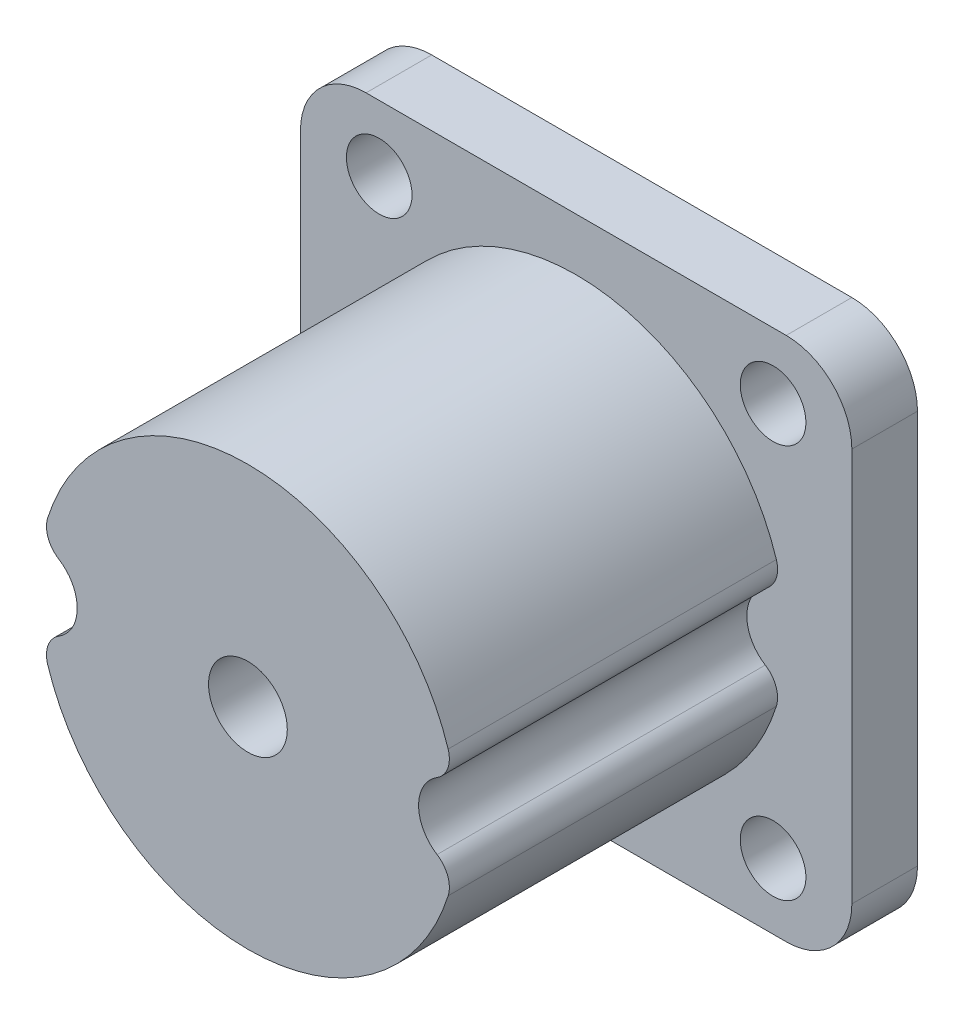
ISO-10303-21;
HEADER;
FILE_DESCRIPTION(('STEP AP214'),'2;1');
FILE_NAME('part.step','',(''),(''),'','','');
FILE_SCHEMA(('AUTOMOTIVE_DESIGN { 1 0 10303 214 1 1 1 1 }'));
ENDSEC;
DATA;
#1=APPLICATION_CONTEXT('core data for automotive mechanical design processes');
#2=APPLICATION_PROTOCOL_DEFINITION('international standard','automotive_design',2000,#1);
#3=PRODUCT_CONTEXT('',#1,'mechanical');
#4=PRODUCT('Part','Part','',(#3));
#5=PRODUCT_RELATED_PRODUCT_CATEGORY('part','',(#4));
#6=PRODUCT_DEFINITION_FORMATION('','',#4);
#7=PRODUCT_DEFINITION_CONTEXT('part definition',#1,'design');
#8=PRODUCT_DEFINITION('design','',#6,#7);
#9=PRODUCT_DEFINITION_SHAPE('','',#8);
#10=(LENGTH_UNIT() NAMED_UNIT(*) SI_UNIT(.MILLI.,.METRE.));
#11=(NAMED_UNIT(*) PLANE_ANGLE_UNIT() SI_UNIT($,.RADIAN.));
#12=(NAMED_UNIT(*) SI_UNIT($,.STERADIAN.) SOLID_ANGLE_UNIT());
#13=UNCERTAINTY_MEASURE_WITH_UNIT(LENGTH_MEASURE(1.E-05),#10,'distance_accuracy_value','');
#14=(GEOMETRIC_REPRESENTATION_CONTEXT(3) GLOBAL_UNCERTAINTY_ASSIGNED_CONTEXT((#13)) GLOBAL_UNIT_ASSIGNED_CONTEXT((#10,
#11,#12)) REPRESENTATION_CONTEXT('',''));
#15=CARTESIAN_POINT('',(0.,0.,0.));
#16=DIRECTION('',(0.,0.,1.));
#17=DIRECTION('',(1.,0.,0.));
#18=AXIS2_PLACEMENT_3D('',#15,#16,#17);
#19=CARTESIAN_POINT('',(0.,0.,5.));
#20=DIRECTION('',(0.,0.,-1.));
#21=DIRECTION('',(-1.,0.,0.));
#22=AXIS2_PLACEMENT_3D('',#19,#20,#21);
#23=PLANE('',#22);
#24=CARTESIAN_POINT('',(16.,0.,5.));
#25=DIRECTION('',(0.,0.,-1.));
#26=DIRECTION('',(1.,0.,0.));
#27=AXIS2_PLACEMENT_3D('',#24,#25,#26);
#28=CIRCLE('',#27,3.);
#29=CARTESIAN_POINT('',(14.40625,-2.54164532094862,5.));
#30=VERTEX_POINT('',#29);
#31=CARTESIAN_POINT('',(14.40625,2.54164532094862,5.));
#32=VERTEX_POINT('',#31);
#33=EDGE_CURVE('E255',#30,#32,#28,.T.);
#34=ORIENTED_EDGE('',*,*,#33,.F.);
#35=CARTESIAN_POINT('',(13.34375,-4.23607553491436,5.));
#36=DIRECTION('',(0.,0.,-1.));
#37=DIRECTION('',(-1.,0.,0.));
#38=AXIS2_PLACEMENT_3D('',#35,#36,#37);
#39=CIRCLE('',#38,2.);
#40=CARTESIAN_POINT('',(15.25,-4.84122918275927,5.));
#41=VERTEX_POINT('',#40);
#42=EDGE_CURVE('E47',#30,#41,#39,.T.);
#43=ORIENTED_EDGE('',*,*,#42,.T.);
#44=CARTESIAN_POINT('',(0.,0.,5.));
#45=DIRECTION('',(0.,0.,1.));
#46=DIRECTION('',(1.,0.,0.));
#47=AXIS2_PLACEMENT_3D('',#44,#45,#46);
#48=CIRCLE('',#47,16.);
#49=CARTESIAN_POINT('',(-15.25,-4.84122918275927,5.));
#50=VERTEX_POINT('',#49);
#51=EDGE_CURVE('E254',#50,#41,#48,.T.);
#52=ORIENTED_EDGE('',*,*,#51,.F.);
#53=CARTESIAN_POINT('',(-13.34375,-4.23607553491436,5.));
#54=DIRECTION('',(0.,0.,-1.));
#55=DIRECTION('',(-1.,0.,0.));
#56=AXIS2_PLACEMENT_3D('',#53,#54,#55);
#57=CIRCLE('',#56,2.);
#58=CARTESIAN_POINT('',(-14.40625,-2.54164532094862,5.));
#59=VERTEX_POINT('',#58);
#60=EDGE_CURVE('E248',#50,#59,#57,.T.);
#61=ORIENTED_EDGE('',*,*,#60,.T.);
#62=CARTESIAN_POINT('',(-16.,0.,5.));
#63=DIRECTION('',(0.,0.,-1.));
#64=DIRECTION('',(1.,0.,0.));
#65=AXIS2_PLACEMENT_3D('',#62,#63,#64);
#66=CIRCLE('',#65,3.);
#67=CARTESIAN_POINT('',(-14.40625,2.54164532094862,5.));
#68=VERTEX_POINT('',#67);
#69=EDGE_CURVE('E262',#68,#59,#66,.T.);
#70=ORIENTED_EDGE('',*,*,#69,.F.);
#71=CARTESIAN_POINT('',(-13.34375,4.23607553491436,5.));
#72=DIRECTION('',(0.,0.,-1.));
#73=DIRECTION('',(-1.,0.,0.));
#74=AXIS2_PLACEMENT_3D('',#71,#72,#73);
#75=CIRCLE('',#74,2.);
#76=CARTESIAN_POINT('',(-15.25,4.84122918275927,5.));
#77=VERTEX_POINT('',#76);
#78=EDGE_CURVE('E250',#68,#77,#75,.T.);
#79=ORIENTED_EDGE('',*,*,#78,.T.);
#80=CARTESIAN_POINT('',(0.,0.,5.));
#81=DIRECTION('',(0.,0.,1.));
#82=DIRECTION('',(1.,0.,0.));
#83=AXIS2_PLACEMENT_3D('',#80,#81,#82);
#84=CIRCLE('',#83,16.);
#85=CARTESIAN_POINT('',(15.25,4.84122918275927,5.));
#86=VERTEX_POINT('',#85);
#87=EDGE_CURVE('E289',#86,#77,#84,.T.);
#88=ORIENTED_EDGE('',*,*,#87,.F.);
#89=CARTESIAN_POINT('',(13.34375,4.23607553491436,5.));
#90=DIRECTION('',(0.,0.,-1.));
#91=DIRECTION('',(-1.,0.,0.));
#92=AXIS2_PLACEMENT_3D('',#89,#90,#91);
#93=CIRCLE('',#92,2.);
#94=EDGE_CURVE('E11',#86,#32,#93,.T.);
#95=ORIENTED_EDGE('',*,*,#94,.T.);
#96=EDGE_LOOP('',(#34,#43,#52,#61,#70,#79,#88,#95));
#97=FACE_BOUND('',#96,.T.);
#98=DIRECTION('',(1.,0.,0.));
#99=VECTOR('',#98,1.);
#100=CARTESIAN_POINT('',(-21.,-20.,5.));
#101=LINE('',#100,#99);
#102=CARTESIAN_POINT('',(-16.,-20.,5.));
#103=VERTEX_POINT('',#102);
#104=CARTESIAN_POINT('',(16.,-20.,5.));
#105=VERTEX_POINT('',#104);
#106=EDGE_CURVE('E188',#103,#105,#101,.T.);
#107=ORIENTED_EDGE('',*,*,#106,.T.);
#108=CARTESIAN_POINT('',(16.,-15.,5.));
#109=DIRECTION('',(0.,0.,-1.));
#110=DIRECTION('',(-1.,0.,0.));
#111=AXIS2_PLACEMENT_3D('',#108,#109,#110);
#112=CIRCLE('',#111,5.);
#113=CARTESIAN_POINT('',(21.,-15.,5.));
#114=VERTEX_POINT('',#113);
#115=EDGE_CURVE('E209',#105,#114,#112,.F.);
#116=ORIENTED_EDGE('',*,*,#115,.T.);
#117=DIRECTION('',(0.,1.,0.));
#118=VECTOR('',#117,1.);
#119=CARTESIAN_POINT('',(21.,-20.,5.));
#120=LINE('',#119,#118);
#121=CARTESIAN_POINT('',(21.,15.,5.));
#122=VERTEX_POINT('',#121);
#123=EDGE_CURVE('E171',#114,#122,#120,.T.);
#124=ORIENTED_EDGE('',*,*,#123,.T.);
#125=CARTESIAN_POINT('',(16.,15.,5.));
#126=DIRECTION('',(0.,0.,-1.));
#127=DIRECTION('',(-1.,0.,0.));
#128=AXIS2_PLACEMENT_3D('',#125,#126,#127);
#129=CIRCLE('',#128,5.);
#130=CARTESIAN_POINT('',(16.,20.,5.));
#131=VERTEX_POINT('',#130);
#132=EDGE_CURVE('E203',#122,#131,#129,.F.);
#133=ORIENTED_EDGE('',*,*,#132,.T.);
#134=DIRECTION('',(-1.,0.,0.));
#135=VECTOR('',#134,1.);
#136=CARTESIAN_POINT('',(-21.,20.,5.));
#137=LINE('',#136,#135);
#138=CARTESIAN_POINT('',(-16.,20.,5.));
#139=VERTEX_POINT('',#138);
#140=EDGE_CURVE('E317',#131,#139,#137,.T.);
#141=ORIENTED_EDGE('',*,*,#140,.T.);
#142=CARTESIAN_POINT('',(-16.,15.,5.));
#143=DIRECTION('',(0.,0.,-1.));
#144=DIRECTION('',(-1.,0.,0.));
#145=AXIS2_PLACEMENT_3D('',#142,#143,#144);
#146=CIRCLE('',#145,5.);
#147=CARTESIAN_POINT('',(-21.,15.,5.));
#148=VERTEX_POINT('',#147);
#149=EDGE_CURVE('E205',#139,#148,#146,.F.);
#150=ORIENTED_EDGE('',*,*,#149,.T.);
#151=DIRECTION('',(0.,-1.,0.));
#152=VECTOR('',#151,1.);
#153=CARTESIAN_POINT('',(-21.,-20.,5.));
#154=LINE('',#153,#152);
#155=CARTESIAN_POINT('',(-21.,-15.,5.));
#156=VERTEX_POINT('',#155);
#157=EDGE_CURVE('E319',#148,#156,#154,.T.);
#158=ORIENTED_EDGE('',*,*,#157,.T.);
#159=CARTESIAN_POINT('',(-16.,-15.,5.));
#160=DIRECTION('',(0.,0.,-1.));
#161=DIRECTION('',(-1.,0.,0.));
#162=AXIS2_PLACEMENT_3D('',#159,#160,#161);
#163=CIRCLE('',#162,5.);
#164=EDGE_CURVE('E207',#156,#103,#163,.F.);
#165=ORIENTED_EDGE('',*,*,#164,.T.);
#166=EDGE_LOOP('',(#107,#116,#124,#133,#141,#150,#158,#165));
#167=FACE_BOUND('',#166,.T.);
#168=CARTESIAN_POINT('',(-15.,15.,5.));
#169=DIRECTION('',(0.,0.,1.));
#170=DIRECTION('',(1.,0.,0.));
#171=AXIS2_PLACEMENT_3D('',#168,#169,#170);
#172=CIRCLE('',#171,2.5);
#173=CARTESIAN_POINT('',(-12.5,15.,5.));
#174=VERTEX_POINT('',#173);
#175=EDGE_CURVE('E185',#174,#174,#172,.T.);
#176=ORIENTED_EDGE('',*,*,#175,.F.);
#177=EDGE_LOOP('',(#176));
#178=FACE_BOUND('',#177,.T.);
#179=CARTESIAN_POINT('',(15.,15.,5.));
#180=DIRECTION('',(0.,0.,1.));
#181=DIRECTION('',(1.,0.,0.));
#182=AXIS2_PLACEMENT_3D('',#179,#180,#181);
#183=CIRCLE('',#182,2.5);
#184=CARTESIAN_POINT('',(17.5,15.,5.));
#185=VERTEX_POINT('',#184);
#186=EDGE_CURVE('E306',#185,#185,#183,.T.);
#187=ORIENTED_EDGE('',*,*,#186,.F.);
#188=EDGE_LOOP('',(#187));
#189=FACE_BOUND('',#188,.T.);
#190=CARTESIAN_POINT('',(15.,-15.,5.));
#191=DIRECTION('',(0.,0.,1.));
#192=DIRECTION('',(-1.,0.,0.));
#193=AXIS2_PLACEMENT_3D('',#190,#191,#192);
#194=CIRCLE('',#193,2.5);
#195=CARTESIAN_POINT('',(12.5,-15.,5.));
#196=VERTEX_POINT('',#195);
#197=EDGE_CURVE('E300',#196,#196,#194,.T.);
#198=ORIENTED_EDGE('',*,*,#197,.F.);
#199=EDGE_LOOP('',(#198));
#200=FACE_BOUND('',#199,.T.);
#201=CARTESIAN_POINT('',(-15.,-15.,5.));
#202=DIRECTION('',(0.,0.,1.));
#203=DIRECTION('',(-1.,0.,0.));
#204=AXIS2_PLACEMENT_3D('',#201,#202,#203);
#205=CIRCLE('',#204,2.5);
#206=CARTESIAN_POINT('',(-17.5,-15.,5.));
#207=VERTEX_POINT('',#206);
#208=EDGE_CURVE('E294',#207,#207,#205,.T.);
#209=ORIENTED_EDGE('',*,*,#208,.F.);
#210=EDGE_LOOP('',(#209));
#211=FACE_BOUND('',#210,.T.);
#212=ADVANCED_FACE('F39',(#97,#167,#178,#189,#200,#211),#23,.F.);
#213=CARTESIAN_POINT('',(0.,0.,0.));
#214=DIRECTION('',(0.,0.,-1.));
#215=DIRECTION('',(-1.,0.,0.));
#216=AXIS2_PLACEMENT_3D('',#213,#214,#215);
#217=PLANE('',#216);
#218=CARTESIAN_POINT('',(15.,-15.,0.));
#219=DIRECTION('',(0.,0.,1.));
#220=DIRECTION('',(-1.,0.,0.));
#221=AXIS2_PLACEMENT_3D('',#218,#219,#220);
#222=CIRCLE('',#221,2.5);
#223=CARTESIAN_POINT('',(12.5,-15.,0.));
#224=VERTEX_POINT('',#223);
#225=EDGE_CURVE('E297',#224,#224,#222,.T.);
#226=ORIENTED_EDGE('',*,*,#225,.T.);
#227=EDGE_LOOP('',(#226));
#228=FACE_BOUND('',#227,.T.);
#229=CARTESIAN_POINT('',(-15.,15.,0.));
#230=DIRECTION('',(0.,0.,1.));
#231=DIRECTION('',(1.,0.,0.));
#232=AXIS2_PLACEMENT_3D('',#229,#230,#231);
#233=CIRCLE('',#232,2.5);
#234=CARTESIAN_POINT('',(-12.5,15.,0.));
#235=VERTEX_POINT('',#234);
#236=EDGE_CURVE('E309',#235,#235,#233,.T.);
#237=ORIENTED_EDGE('',*,*,#236,.T.);
#238=EDGE_LOOP('',(#237));
#239=FACE_BOUND('',#238,.T.);
#240=DIRECTION('',(0.,1.,0.));
#241=VECTOR('',#240,1.);
#242=CARTESIAN_POINT('',(21.,-20.,0.));
#243=LINE('',#242,#241);
#244=CARTESIAN_POINT('',(21.,-15.,0.));
#245=VERTEX_POINT('',#244);
#246=CARTESIAN_POINT('',(21.,15.,0.));
#247=VERTEX_POINT('',#246);
#248=EDGE_CURVE('E168',#245,#247,#243,.T.);
#249=ORIENTED_EDGE('',*,*,#248,.F.);
#250=CARTESIAN_POINT('',(16.,-15.,0.));
#251=DIRECTION('',(0.,0.,-1.));
#252=DIRECTION('',(-1.,0.,0.));
#253=AXIS2_PLACEMENT_3D('',#250,#251,#252);
#254=CIRCLE('',#253,5.);
#255=CARTESIAN_POINT('',(16.,-20.,0.));
#256=VERTEX_POINT('',#255);
#257=EDGE_CURVE('E151',#245,#256,#254,.T.);
#258=ORIENTED_EDGE('',*,*,#257,.T.);
#259=DIRECTION('',(1.,0.,0.));
#260=VECTOR('',#259,1.);
#261=CARTESIAN_POINT('',(-21.,-20.,0.));
#262=LINE('',#261,#260);
#263=CARTESIAN_POINT('',(-16.,-20.,0.));
#264=VERTEX_POINT('',#263);
#265=EDGE_CURVE('E193',#264,#256,#262,.T.);
#266=ORIENTED_EDGE('',*,*,#265,.F.);
#267=CARTESIAN_POINT('',(-16.,-15.,0.));
#268=DIRECTION('',(0.,0.,-1.));
#269=DIRECTION('',(-1.,0.,0.));
#270=AXIS2_PLACEMENT_3D('',#267,#268,#269);
#271=CIRCLE('',#270,5.);
#272=CARTESIAN_POINT('',(-21.,-15.,0.));
#273=VERTEX_POINT('',#272);
#274=EDGE_CURVE('E162',#264,#273,#271,.T.);
#275=ORIENTED_EDGE('',*,*,#274,.T.);
#276=DIRECTION('',(0.,-1.,0.));
#277=VECTOR('',#276,1.);
#278=CARTESIAN_POINT('',(-21.,-20.,0.));
#279=LINE('',#278,#277);
#280=CARTESIAN_POINT('',(-21.,15.,0.));
#281=VERTEX_POINT('',#280);
#282=EDGE_CURVE('E182',#281,#273,#279,.T.);
#283=ORIENTED_EDGE('',*,*,#282,.F.);
#284=CARTESIAN_POINT('',(-16.,15.,0.));
#285=DIRECTION('',(0.,0.,-1.));
#286=DIRECTION('',(-1.,0.,0.));
#287=AXIS2_PLACEMENT_3D('',#284,#285,#286);
#288=CIRCLE('',#287,5.);
#289=CARTESIAN_POINT('',(-16.,20.,0.));
#290=VERTEX_POINT('',#289);
#291=EDGE_CURVE('E197',#281,#290,#288,.T.);
#292=ORIENTED_EDGE('',*,*,#291,.T.);
#293=DIRECTION('',(-1.,0.,0.));
#294=VECTOR('',#293,1.);
#295=CARTESIAN_POINT('',(-21.,20.,0.));
#296=LINE('',#295,#294);
#297=CARTESIAN_POINT('',(16.,20.,0.));
#298=VERTEX_POINT('',#297);
#299=EDGE_CURVE('E178',#298,#290,#296,.T.);
#300=ORIENTED_EDGE('',*,*,#299,.F.);
#301=CARTESIAN_POINT('',(16.,15.,0.));
#302=DIRECTION('',(0.,0.,-1.));
#303=DIRECTION('',(-1.,0.,0.));
#304=AXIS2_PLACEMENT_3D('',#301,#302,#303);
#305=CIRCLE('',#304,5.);
#306=EDGE_CURVE('E172',#298,#247,#305,.T.);
#307=ORIENTED_EDGE('',*,*,#306,.T.);
#308=EDGE_LOOP('',(#249,#258,#266,#275,#283,#292,#300,#307));
#309=FACE_BOUND('',#308,.T.);
#310=CARTESIAN_POINT('',(0.,0.,0.));
#311=DIRECTION('',(0.,0.,1.));
#312=DIRECTION('',(1.,0.,0.));
#313=AXIS2_PLACEMENT_3D('',#310,#311,#312);
#314=CIRCLE('',#313,3.);
#315=CARTESIAN_POINT('',(3.,0.,0.));
#316=VERTEX_POINT('',#315);
#317=EDGE_CURVE('E179',#316,#316,#314,.T.);
#318=ORIENTED_EDGE('',*,*,#317,.T.);
#319=EDGE_LOOP('',(#318));
#320=FACE_BOUND('',#319,.T.);
#321=CARTESIAN_POINT('',(15.,15.,0.));
#322=DIRECTION('',(0.,0.,1.));
#323=DIRECTION('',(1.,0.,0.));
#324=AXIS2_PLACEMENT_3D('',#321,#322,#323);
#325=CIRCLE('',#324,2.5);
#326=CARTESIAN_POINT('',(17.5,15.,0.));
#327=VERTEX_POINT('',#326);
#328=EDGE_CURVE('E303',#327,#327,#325,.T.);
#329=ORIENTED_EDGE('',*,*,#328,.T.);
#330=EDGE_LOOP('',(#329));
#331=FACE_BOUND('',#330,.T.);
#332=CARTESIAN_POINT('',(-15.,-15.,0.));
#333=DIRECTION('',(0.,0.,1.));
#334=DIRECTION('',(-1.,0.,0.));
#335=AXIS2_PLACEMENT_3D('',#332,#333,#334);
#336=CIRCLE('',#335,2.5);
#337=CARTESIAN_POINT('',(-17.5,-15.,0.));
#338=VERTEX_POINT('',#337);
#339=EDGE_CURVE('E287',#338,#338,#336,.T.);
#340=ORIENTED_EDGE('',*,*,#339,.T.);
#341=EDGE_LOOP('',(#340));
#342=FACE_BOUND('',#341,.T.);
#343=ADVANCED_FACE('F175',(#228,#239,#309,#320,#331,#342),#217,.T.);
#344=CARTESIAN_POINT('',(21.,-20.,5.));
#345=DIRECTION('',(-1.,0.,0.));
#346=DIRECTION('',(0.,0.,1.));
#347=AXIS2_PLACEMENT_3D('',#344,#345,#346);
#348=PLANE('',#347);
#349=ORIENTED_EDGE('',*,*,#123,.F.);
#350=DIRECTION('',(0.,0.,-1.));
#351=VECTOR('',#350,1.);
#352=CARTESIAN_POINT('',(21.,-15.,5.));
#353=LINE('',#352,#351);
#354=EDGE_CURVE('E155',#114,#245,#353,.T.);
#355=ORIENTED_EDGE('',*,*,#354,.T.);
#356=ORIENTED_EDGE('',*,*,#248,.T.);
#357=DIRECTION('',(0.,0.,-1.));
#358=VECTOR('',#357,1.);
#359=CARTESIAN_POINT('',(21.,15.,5.));
#360=LINE('',#359,#358);
#361=EDGE_CURVE('E173',#247,#122,#360,.F.);
#362=ORIENTED_EDGE('',*,*,#361,.T.);
#363=EDGE_LOOP('',(#349,#355,#356,#362));
#364=FACE_BOUND('',#363,.T.);
#365=ADVANCED_FACE('F167',(#364),#348,.F.);
#366=CARTESIAN_POINT('',(-21.,20.,5.));
#367=DIRECTION('',(0.,-1.,0.));
#368=DIRECTION('',(0.,0.,-1.));
#369=AXIS2_PLACEMENT_3D('',#366,#367,#368);
#370=PLANE('',#369);
#371=ORIENTED_EDGE('',*,*,#299,.T.);
#372=DIRECTION('',(0.,0.,-1.));
#373=VECTOR('',#372,1.);
#374=CARTESIAN_POINT('',(-16.,20.,5.));
#375=LINE('',#374,#373);
#376=EDGE_CURVE('E219',#290,#139,#375,.F.);
#377=ORIENTED_EDGE('',*,*,#376,.T.);
#378=ORIENTED_EDGE('',*,*,#140,.F.);
#379=DIRECTION('',(0.,0.,-1.));
#380=VECTOR('',#379,1.);
#381=CARTESIAN_POINT('',(16.,20.,5.));
#382=LINE('',#381,#380);
#383=EDGE_CURVE('E216',#131,#298,#382,.T.);
#384=ORIENTED_EDGE('',*,*,#383,.T.);
#385=EDGE_LOOP('',(#371,#377,#378,#384));
#386=FACE_BOUND('',#385,.T.);
#387=ADVANCED_FACE('F341',(#386),#370,.F.);
#388=CARTESIAN_POINT('',(-21.,-20.,5.));
#389=DIRECTION('',(1.,0.,0.));
#390=DIRECTION('',(0.,0.,-1.));
#391=AXIS2_PLACEMENT_3D('',#388,#389,#390);
#392=PLANE('',#391);
#393=ORIENTED_EDGE('',*,*,#282,.T.);
#394=DIRECTION('',(0.,0.,-1.));
#395=VECTOR('',#394,1.);
#396=CARTESIAN_POINT('',(-21.,-15.,5.));
#397=LINE('',#396,#395);
#398=EDGE_CURVE('E214',#273,#156,#397,.F.);
#399=ORIENTED_EDGE('',*,*,#398,.T.);
#400=ORIENTED_EDGE('',*,*,#157,.F.);
#401=DIRECTION('',(0.,0.,-1.));
#402=VECTOR('',#401,1.);
#403=CARTESIAN_POINT('',(-21.,15.,5.));
#404=LINE('',#403,#402);
#405=EDGE_CURVE('E211',#148,#281,#404,.T.);
#406=ORIENTED_EDGE('',*,*,#405,.T.);
#407=EDGE_LOOP('',(#393,#399,#400,#406));
#408=FACE_BOUND('',#407,.T.);
#409=ADVANCED_FACE('F334',(#408),#392,.F.);
#410=CARTESIAN_POINT('',(-21.,-20.,5.));
#411=DIRECTION('',(0.,1.,0.));
#412=DIRECTION('',(0.,0.,1.));
#413=AXIS2_PLACEMENT_3D('',#410,#411,#412);
#414=PLANE('',#413);
#415=ORIENTED_EDGE('',*,*,#265,.T.);
#416=DIRECTION('',(0.,0.,-1.));
#417=VECTOR('',#416,1.);
#418=CARTESIAN_POINT('',(16.,-20.,5.));
#419=LINE('',#418,#417);
#420=EDGE_CURVE('E156',#256,#105,#419,.F.);
#421=ORIENTED_EDGE('',*,*,#420,.T.);
#422=ORIENTED_EDGE('',*,*,#106,.F.);
#423=DIRECTION('',(0.,0.,-1.));
#424=VECTOR('',#423,1.);
#425=CARTESIAN_POINT('',(-16.,-20.,5.));
#426=LINE('',#425,#424);
#427=EDGE_CURVE('E161',#103,#264,#426,.T.);
#428=ORIENTED_EDGE('',*,*,#427,.T.);
#429=EDGE_LOOP('',(#415,#421,#422,#428));
#430=FACE_BOUND('',#429,.T.);
#431=ADVANCED_FACE('F328',(#430),#414,.F.);
#432=CARTESIAN_POINT('',(0.,0.,5.));
#433=DIRECTION('',(0.,0.,-1.));
#434=DIRECTION('',(-1.,0.,0.));
#435=AXIS2_PLACEMENT_3D('',#432,#433,#434);
#436=CYLINDRICAL_SURFACE('',#435,3.);
#437=ORIENTED_EDGE('',*,*,#317,.F.);
#438=EDGE_LOOP('',(#437));
#439=FACE_BOUND('',#438,.T.);
#440=CARTESIAN_POINT('',(0.,0.,30.));
#441=DIRECTION('',(0.,0.,1.));
#442=DIRECTION('',(1.,0.,0.));
#443=AXIS2_PLACEMENT_3D('',#440,#441,#442);
#444=CIRCLE('',#443,3.);
#445=CARTESIAN_POINT('',(3.,0.,30.));
#446=VERTEX_POINT('',#445);
#447=EDGE_CURVE('E283',#446,#446,#444,.T.);
#448=ORIENTED_EDGE('',*,*,#447,.T.);
#449=EDGE_LOOP('',(#448));
#450=FACE_BOUND('',#449,.T.);
#451=ADVANCED_FACE('F365',(#439,#450),#436,.F.);
#452=CARTESIAN_POINT('',(-15.,15.,5.));
#453=DIRECTION('',(0.,0.,-1.));
#454=DIRECTION('',(-1.,0.,0.));
#455=AXIS2_PLACEMENT_3D('',#452,#453,#454);
#456=CYLINDRICAL_SURFACE('',#455,2.5);
#457=ORIENTED_EDGE('',*,*,#175,.T.);
#458=EDGE_LOOP('',(#457));
#459=FACE_BOUND('',#458,.T.);
#460=ORIENTED_EDGE('',*,*,#236,.F.);
#461=EDGE_LOOP('',(#460));
#462=FACE_BOUND('',#461,.T.);
#463=ADVANCED_FACE('F397',(#459,#462),#456,.F.);
#464=CARTESIAN_POINT('',(15.,15.,5.));
#465=DIRECTION('',(0.,0.,-1.));
#466=DIRECTION('',(-1.,0.,0.));
#467=AXIS2_PLACEMENT_3D('',#464,#465,#466);
#468=CYLINDRICAL_SURFACE('',#467,2.5);
#469=ORIENTED_EDGE('',*,*,#186,.T.);
#470=EDGE_LOOP('',(#469));
#471=FACE_BOUND('',#470,.T.);
#472=ORIENTED_EDGE('',*,*,#328,.F.);
#473=EDGE_LOOP('',(#472));
#474=FACE_BOUND('',#473,.T.);
#475=ADVANCED_FACE('F477',(#471,#474),#468,.F.);
#476=CARTESIAN_POINT('',(15.,-15.,5.));
#477=DIRECTION('',(0.,0.,-1.));
#478=DIRECTION('',(-1.,0.,0.));
#479=AXIS2_PLACEMENT_3D('',#476,#477,#478);
#480=CYLINDRICAL_SURFACE('',#479,2.5);
#481=ORIENTED_EDGE('',*,*,#197,.T.);
#482=EDGE_LOOP('',(#481));
#483=FACE_BOUND('',#482,.T.);
#484=ORIENTED_EDGE('',*,*,#225,.F.);
#485=EDGE_LOOP('',(#484));
#486=FACE_BOUND('',#485,.T.);
#487=ADVANCED_FACE('F473',(#483,#486),#480,.F.);
#488=CARTESIAN_POINT('',(-15.,-15.,5.));
#489=DIRECTION('',(0.,0.,-1.));
#490=DIRECTION('',(-1.,0.,0.));
#491=AXIS2_PLACEMENT_3D('',#488,#489,#490);
#492=CYLINDRICAL_SURFACE('',#491,2.5);
#493=ORIENTED_EDGE('',*,*,#208,.T.);
#494=EDGE_LOOP('',(#493));
#495=FACE_BOUND('',#494,.T.);
#496=ORIENTED_EDGE('',*,*,#339,.F.);
#497=EDGE_LOOP('',(#496));
#498=FACE_BOUND('',#497,.T.);
#499=ADVANCED_FACE('F378',(#495,#498),#492,.F.);
#500=CARTESIAN_POINT('',(16.,-15.,5.));
#501=DIRECTION('',(0.,0.,-1.));
#502=DIRECTION('',(-1.,0.,0.));
#503=AXIS2_PLACEMENT_3D('',#500,#501,#502);
#504=CYLINDRICAL_SURFACE('',#503,5.);
#505=ORIENTED_EDGE('',*,*,#115,.F.);
#506=ORIENTED_EDGE('',*,*,#420,.F.);
#507=ORIENTED_EDGE('',*,*,#257,.F.);
#508=ORIENTED_EDGE('',*,*,#354,.F.);
#509=EDGE_LOOP('',(#505,#506,#507,#508));
#510=FACE_BOUND('',#509,.T.);
#511=ADVANCED_FACE('F154',(#510),#504,.T.);
#512=CARTESIAN_POINT('',(-16.,-15.,5.));
#513=DIRECTION('',(0.,0.,-1.));
#514=DIRECTION('',(-1.,0.,0.));
#515=AXIS2_PLACEMENT_3D('',#512,#513,#514);
#516=CYLINDRICAL_SURFACE('',#515,5.);
#517=ORIENTED_EDGE('',*,*,#164,.F.);
#518=ORIENTED_EDGE('',*,*,#398,.F.);
#519=ORIENTED_EDGE('',*,*,#274,.F.);
#520=ORIENTED_EDGE('',*,*,#427,.F.);
#521=EDGE_LOOP('',(#517,#518,#519,#520));
#522=FACE_BOUND('',#521,.T.);
#523=ADVANCED_FACE('F330',(#522),#516,.T.);
#524=CARTESIAN_POINT('',(-16.,15.,5.));
#525=DIRECTION('',(0.,0.,-1.));
#526=DIRECTION('',(-1.,0.,0.));
#527=AXIS2_PLACEMENT_3D('',#524,#525,#526);
#528=CYLINDRICAL_SURFACE('',#527,5.);
#529=ORIENTED_EDGE('',*,*,#149,.F.);
#530=ORIENTED_EDGE('',*,*,#376,.F.);
#531=ORIENTED_EDGE('',*,*,#291,.F.);
#532=ORIENTED_EDGE('',*,*,#405,.F.);
#533=EDGE_LOOP('',(#529,#530,#531,#532));
#534=FACE_BOUND('',#533,.T.);
#535=ADVANCED_FACE('F338',(#534),#528,.T.);
#536=CARTESIAN_POINT('',(16.,15.,5.));
#537=DIRECTION('',(0.,0.,-1.));
#538=DIRECTION('',(-1.,0.,0.));
#539=AXIS2_PLACEMENT_3D('',#536,#537,#538);
#540=CYLINDRICAL_SURFACE('',#539,5.);
#541=ORIENTED_EDGE('',*,*,#132,.F.);
#542=ORIENTED_EDGE('',*,*,#361,.F.);
#543=ORIENTED_EDGE('',*,*,#306,.F.);
#544=ORIENTED_EDGE('',*,*,#383,.F.);
#545=EDGE_LOOP('',(#541,#542,#543,#544));
#546=FACE_BOUND('',#545,.T.);
#547=ADVANCED_FACE('F346',(#546),#540,.T.);
#548=CARTESIAN_POINT('',(8.,0.,30.));
#549=DIRECTION('',(0.,0.,1.));
#550=DIRECTION('',(1.,0.,0.));
#551=AXIS2_PLACEMENT_3D('',#548,#549,#550);
#552=PLANE('',#551);
#553=CARTESIAN_POINT('',(-16.,0.,30.));
#554=DIRECTION('',(0.,0.,-1.));
#555=DIRECTION('',(1.,0.,0.));
#556=AXIS2_PLACEMENT_3D('',#553,#554,#555);
#557=CIRCLE('',#556,3.);
#558=CARTESIAN_POINT('',(-14.40625,2.54164532094862,30.));
#559=VERTEX_POINT('',#558);
#560=CARTESIAN_POINT('',(-14.40625,-2.54164532094862,30.));
#561=VERTEX_POINT('',#560);
#562=EDGE_CURVE('E280',#559,#561,#557,.T.);
#563=ORIENTED_EDGE('',*,*,#562,.T.);
#564=CARTESIAN_POINT('',(-13.34375,-4.23607553491436,30.));
#565=DIRECTION('',(0.,0.,1.));
#566=DIRECTION('',(1.,0.,0.));
#567=AXIS2_PLACEMENT_3D('',#564,#565,#566);
#568=CIRCLE('',#567,2.);
#569=CARTESIAN_POINT('',(-15.25,-4.84122918275927,30.));
#570=VERTEX_POINT('',#569);
#571=EDGE_CURVE('E237',#561,#570,#568,.T.);
#572=ORIENTED_EDGE('',*,*,#571,.T.);
#573=CARTESIAN_POINT('',(0.,0.,30.));
#574=DIRECTION('',(0.,0.,1.));
#575=DIRECTION('',(1.,0.,0.));
#576=AXIS2_PLACEMENT_3D('',#573,#574,#575);
#577=CIRCLE('',#576,16.);
#578=CARTESIAN_POINT('',(15.25,-4.84122918275927,30.));
#579=VERTEX_POINT('',#578);
#580=EDGE_CURVE('E273',#570,#579,#577,.T.);
#581=ORIENTED_EDGE('',*,*,#580,.T.);
#582=CARTESIAN_POINT('',(13.34375,-4.23607553491436,30.));
#583=DIRECTION('',(0.,0.,1.));
#584=DIRECTION('',(1.,0.,0.));
#585=AXIS2_PLACEMENT_3D('',#582,#583,#584);
#586=CIRCLE('',#585,2.);
#587=CARTESIAN_POINT('',(14.40625,-2.54164532094862,30.));
#588=VERTEX_POINT('',#587);
#589=EDGE_CURVE('E233',#579,#588,#586,.T.);
#590=ORIENTED_EDGE('',*,*,#589,.T.);
#591=CARTESIAN_POINT('',(16.,0.,30.));
#592=DIRECTION('',(0.,0.,-1.));
#593=DIRECTION('',(1.,0.,0.));
#594=AXIS2_PLACEMENT_3D('',#591,#592,#593);
#595=CIRCLE('',#594,3.);
#596=CARTESIAN_POINT('',(14.40625,2.54164532094862,30.));
#597=VERTEX_POINT('',#596);
#598=EDGE_CURVE('E261',#588,#597,#595,.T.);
#599=ORIENTED_EDGE('',*,*,#598,.T.);
#600=CARTESIAN_POINT('',(13.34375,4.23607553491436,30.));
#601=DIRECTION('',(0.,0.,1.));
#602=DIRECTION('',(1.,0.,0.));
#603=AXIS2_PLACEMENT_3D('',#600,#601,#602);
#604=CIRCLE('',#603,2.);
#605=CARTESIAN_POINT('',(15.25,4.84122918275927,30.));
#606=VERTEX_POINT('',#605);
#607=EDGE_CURVE('E231',#597,#606,#604,.T.);
#608=ORIENTED_EDGE('',*,*,#607,.T.);
#609=CARTESIAN_POINT('',(0.,0.,30.));
#610=DIRECTION('',(0.,0.,1.));
#611=DIRECTION('',(1.,0.,0.));
#612=AXIS2_PLACEMENT_3D('',#609,#610,#611);
#613=CIRCLE('',#612,16.);
#614=CARTESIAN_POINT('',(-15.25,4.84122918275927,30.));
#615=VERTEX_POINT('',#614);
#616=EDGE_CURVE('E277',#606,#615,#613,.T.);
#617=ORIENTED_EDGE('',*,*,#616,.T.);
#618=CARTESIAN_POINT('',(-13.34375,4.23607553491436,30.));
#619=DIRECTION('',(0.,0.,1.));
#620=DIRECTION('',(1.,0.,0.));
#621=AXIS2_PLACEMENT_3D('',#618,#619,#620);
#622=CIRCLE('',#621,2.);
#623=EDGE_CURVE('E235',#615,#559,#622,.T.);
#624=ORIENTED_EDGE('',*,*,#623,.T.);
#625=EDGE_LOOP('',(#563,#572,#581,#590,#599,#608,#617,#624));
#626=FACE_BOUND('',#625,.T.);
#627=ORIENTED_EDGE('',*,*,#447,.F.);
#628=EDGE_LOOP('',(#627));
#629=FACE_BOUND('',#628,.T.);
#630=ADVANCED_FACE('F270',(#626,#629),#552,.T.);
#631=CARTESIAN_POINT('',(16.,0.,30.));
#632=DIRECTION('',(0.,0.,-1.));
#633=DIRECTION('',(-1.,0.,0.));
#634=AXIS2_PLACEMENT_3D('',#631,#632,#633);
#635=CYLINDRICAL_SURFACE('',#634,3.);
#636=ORIENTED_EDGE('',*,*,#598,.F.);
#637=DIRECTION('',(0.,0.,-1.));
#638=VECTOR('',#637,1.);
#639=CARTESIAN_POINT('',(14.40625,-2.54164532094862,30.));
#640=LINE('',#639,#638);
#641=EDGE_CURVE('E246',#588,#30,#640,.T.);
#642=ORIENTED_EDGE('',*,*,#641,.T.);
#643=ORIENTED_EDGE('',*,*,#33,.T.);
#644=DIRECTION('',(0.,0.,-1.));
#645=VECTOR('',#644,1.);
#646=CARTESIAN_POINT('',(14.40625,2.54164532094862,30.));
#647=LINE('',#646,#645);
#648=EDGE_CURVE('E244',#32,#597,#647,.F.);
#649=ORIENTED_EDGE('',*,*,#648,.T.);
#650=EDGE_LOOP('',(#636,#642,#643,#649));
#651=FACE_BOUND('',#650,.T.);
#652=ADVANCED_FACE('F275',(#651),#635,.F.);
#653=CARTESIAN_POINT('',(0.,0.,30.));
#654=DIRECTION('',(0.,0.,-1.));
#655=DIRECTION('',(-1.,0.,0.));
#656=AXIS2_PLACEMENT_3D('',#653,#654,#655);
#657=CYLINDRICAL_SURFACE('',#656,16.);
#658=ORIENTED_EDGE('',*,*,#87,.T.);
#659=DIRECTION('',(0.,0.,-1.));
#660=VECTOR('',#659,1.);
#661=CARTESIAN_POINT('',(-15.25,4.84122918275927,30.));
#662=LINE('',#661,#660);
#663=EDGE_CURVE('E242',#77,#615,#662,.F.);
#664=ORIENTED_EDGE('',*,*,#663,.T.);
#665=ORIENTED_EDGE('',*,*,#616,.F.);
#666=DIRECTION('',(0.,0.,-1.));
#667=VECTOR('',#666,1.);
#668=CARTESIAN_POINT('',(15.25,4.84122918275927,30.));
#669=LINE('',#668,#667);
#670=EDGE_CURVE('E239',#606,#86,#669,.T.);
#671=ORIENTED_EDGE('',*,*,#670,.T.);
#672=EDGE_LOOP('',(#658,#664,#665,#671));
#673=FACE_BOUND('',#672,.T.);
#674=ADVANCED_FACE('F412',(#673),#657,.T.);
#675=CARTESIAN_POINT('',(-16.,0.,30.));
#676=DIRECTION('',(0.,0.,-1.));
#677=DIRECTION('',(-1.,0.,0.));
#678=AXIS2_PLACEMENT_3D('',#675,#676,#677);
#679=CYLINDRICAL_SURFACE('',#678,3.);
#680=ORIENTED_EDGE('',*,*,#69,.T.);
#681=DIRECTION('',(0.,0.,-1.));
#682=VECTOR('',#681,1.);
#683=CARTESIAN_POINT('',(-14.40625,-2.54164532094862,30.));
#684=LINE('',#683,#682);
#685=EDGE_CURVE('E229',#59,#561,#684,.F.);
#686=ORIENTED_EDGE('',*,*,#685,.T.);
#687=ORIENTED_EDGE('',*,*,#562,.F.);
#688=DIRECTION('',(0.,0.,-1.));
#689=VECTOR('',#688,1.);
#690=CARTESIAN_POINT('',(-14.40625,2.54164532094862,30.));
#691=LINE('',#690,#689);
#692=EDGE_CURVE('E226',#559,#68,#691,.T.);
#693=ORIENTED_EDGE('',*,*,#692,.T.);
#694=EDGE_LOOP('',(#680,#686,#687,#693));
#695=FACE_BOUND('',#694,.T.);
#696=ADVANCED_FACE('F419',(#695),#679,.F.);
#697=CARTESIAN_POINT('',(0.,0.,30.));
#698=DIRECTION('',(0.,0.,-1.));
#699=DIRECTION('',(-1.,0.,0.));
#700=AXIS2_PLACEMENT_3D('',#697,#698,#699);
#701=CYLINDRICAL_SURFACE('',#700,16.);
#702=ORIENTED_EDGE('',*,*,#580,.F.);
#703=DIRECTION('',(0.,0.,-1.));
#704=VECTOR('',#703,1.);
#705=CARTESIAN_POINT('',(-15.25,-4.84122918275927,30.));
#706=LINE('',#705,#704);
#707=EDGE_CURVE('E223',#570,#50,#706,.T.);
#708=ORIENTED_EDGE('',*,*,#707,.T.);
#709=ORIENTED_EDGE('',*,*,#51,.T.);
#710=DIRECTION('',(0.,0.,-1.));
#711=VECTOR('',#710,1.);
#712=CARTESIAN_POINT('',(15.25,-4.84122918275927,30.));
#713=LINE('',#712,#711);
#714=EDGE_CURVE('E221',#41,#579,#713,.F.);
#715=ORIENTED_EDGE('',*,*,#714,.T.);
#716=EDGE_LOOP('',(#702,#708,#709,#715));
#717=FACE_BOUND('',#716,.T.);
#718=ADVANCED_FACE('F258',(#717),#701,.T.);
#719=CARTESIAN_POINT('',(-13.34375,-4.23607553491436,30.));
#720=DIRECTION('',(0.,0.,1.));
#721=DIRECTION('',(1.,0.,0.));
#722=AXIS2_PLACEMENT_3D('',#719,#720,#721);
#723=CYLINDRICAL_SURFACE('',#722,2.);
#724=ORIENTED_EDGE('',*,*,#571,.F.);
#725=ORIENTED_EDGE('',*,*,#685,.F.);
#726=ORIENTED_EDGE('',*,*,#60,.F.);
#727=ORIENTED_EDGE('',*,*,#707,.F.);
#728=EDGE_LOOP('',(#724,#725,#726,#727));
#729=FACE_BOUND('',#728,.T.);
#730=ADVANCED_FACE('F434',(#729),#723,.T.);
#731=CARTESIAN_POINT('',(-13.34375,4.23607553491436,30.));
#732=DIRECTION('',(0.,0.,1.));
#733=DIRECTION('',(1.,0.,0.));
#734=AXIS2_PLACEMENT_3D('',#731,#732,#733);
#735=CYLINDRICAL_SURFACE('',#734,2.);
#736=ORIENTED_EDGE('',*,*,#623,.F.);
#737=ORIENTED_EDGE('',*,*,#663,.F.);
#738=ORIENTED_EDGE('',*,*,#78,.F.);
#739=ORIENTED_EDGE('',*,*,#692,.F.);
#740=EDGE_LOOP('',(#736,#737,#738,#739));
#741=FACE_BOUND('',#740,.T.);
#742=ADVANCED_FACE('F441',(#741),#735,.T.);
#743=CARTESIAN_POINT('',(13.34375,-4.23607553491436,30.));
#744=DIRECTION('',(0.,0.,1.));
#745=DIRECTION('',(1.,0.,0.));
#746=AXIS2_PLACEMENT_3D('',#743,#744,#745);
#747=CYLINDRICAL_SURFACE('',#746,2.);
#748=ORIENTED_EDGE('',*,*,#589,.F.);
#749=ORIENTED_EDGE('',*,*,#714,.F.);
#750=ORIENTED_EDGE('',*,*,#42,.F.);
#751=ORIENTED_EDGE('',*,*,#641,.F.);
#752=EDGE_LOOP('',(#748,#749,#750,#751));
#753=FACE_BOUND('',#752,.T.);
#754=ADVANCED_FACE('F265',(#753),#747,.T.);
#755=CARTESIAN_POINT('',(13.34375,4.23607553491436,30.));
#756=DIRECTION('',(0.,0.,1.));
#757=DIRECTION('',(1.,0.,0.));
#758=AXIS2_PLACEMENT_3D('',#755,#756,#757);
#759=CYLINDRICAL_SURFACE('',#758,2.);
#760=ORIENTED_EDGE('',*,*,#607,.F.);
#761=ORIENTED_EDGE('',*,*,#648,.F.);
#762=ORIENTED_EDGE('',*,*,#94,.F.);
#763=ORIENTED_EDGE('',*,*,#670,.F.);
#764=EDGE_LOOP('',(#760,#761,#762,#763));
#765=FACE_BOUND('',#764,.T.);
#766=ADVANCED_FACE('F41',(#765),#759,.T.);
#767=CLOSED_SHELL('',(#212,#343,#365,#387,#409,#431,#451,#463,#475,#487,#499,#511,#523,#535,
#547,#630,#652,#674,#696,#718,#730,#742,#754,#766));
#768=MANIFOLD_SOLID_BREP('B2',#767);
#769=ADVANCED_BREP_SHAPE_REPRESENTATION('',(#18,#768),#14);
#770=SHAPE_DEFINITION_REPRESENTATION(#9,#769);
ENDSEC;
END-ISO-10303-21;
